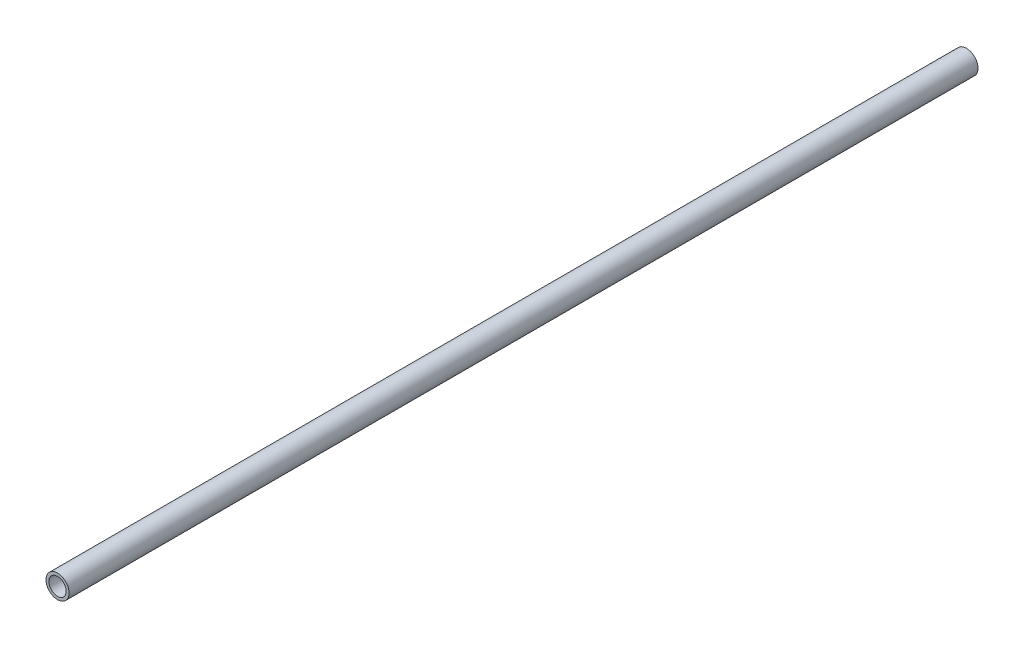
ISO-10303-21;
HEADER;
FILE_DESCRIPTION(('STEP AP214'),'2;1');
FILE_NAME('part.step','',(''),(''),'','','');
FILE_SCHEMA(('AUTOMOTIVE_DESIGN { 1 0 10303 214 1 1 1 1 }'));
ENDSEC;
DATA;
#1=APPLICATION_CONTEXT('core data for automotive mechanical design processes');
#2=APPLICATION_PROTOCOL_DEFINITION('international standard','automotive_design',2000,#1);
#3=PRODUCT_CONTEXT('',#1,'mechanical');
#4=PRODUCT('Part','Part','',(#3));
#5=PRODUCT_RELATED_PRODUCT_CATEGORY('part','',(#4));
#6=PRODUCT_DEFINITION_FORMATION('','',#4);
#7=PRODUCT_DEFINITION_CONTEXT('part definition',#1,'design');
#8=PRODUCT_DEFINITION('design','',#6,#7);
#9=PRODUCT_DEFINITION_SHAPE('','',#8);
#10=(LENGTH_UNIT() NAMED_UNIT(*) SI_UNIT(.MILLI.,.METRE.));
#11=(NAMED_UNIT(*) PLANE_ANGLE_UNIT() SI_UNIT($,.RADIAN.));
#12=(NAMED_UNIT(*) SI_UNIT($,.STERADIAN.) SOLID_ANGLE_UNIT());
#13=UNCERTAINTY_MEASURE_WITH_UNIT(LENGTH_MEASURE(1.E-05),#10,'distance_accuracy_value','');
#14=(GEOMETRIC_REPRESENTATION_CONTEXT(3) GLOBAL_UNCERTAINTY_ASSIGNED_CONTEXT((#13)) GLOBAL_UNIT_ASSIGNED_CONTEXT((#10,
#11,#12)) REPRESENTATION_CONTEXT('',''));
#15=CARTESIAN_POINT('',(0.,0.,0.));
#16=DIRECTION('',(0.,0.,1.));
#17=DIRECTION('',(1.,0.,0.));
#18=AXIS2_PLACEMENT_3D('',#15,#16,#17);
#19=CARTESIAN_POINT('',(0.,0.,500.));
#20=DIRECTION('',(0.,0.,1.));
#21=DIRECTION('',(1.,0.,0.));
#22=AXIS2_PLACEMENT_3D('',#19,#20,#21);
#23=PLANE('',#22);
#24=CARTESIAN_POINT('',(0.,0.,500.));
#25=DIRECTION('',(0.,0.,1.));
#26=DIRECTION('',(1.,0.,0.));
#27=AXIS2_PLACEMENT_3D('',#24,#25,#26);
#28=CIRCLE('',#27,6.35);
#29=CARTESIAN_POINT('',(6.35,0.,500.));
#30=VERTEX_POINT('',#29);
#31=EDGE_CURVE('E10',#30,#30,#28,.T.);
#32=ORIENTED_EDGE('',*,*,#31,.T.);
#33=EDGE_LOOP('',(#32));
#34=FACE_BOUND('',#33,.T.);
#35=CARTESIAN_POINT('',(0.,0.,500.));
#36=DIRECTION('',(0.,0.,1.));
#37=DIRECTION('',(1.,0.,0.));
#38=AXIS2_PLACEMENT_3D('',#35,#36,#37);
#39=CIRCLE('',#38,4.7625);
#40=CARTESIAN_POINT('',(4.7625,0.,500.));
#41=VERTEX_POINT('',#40);
#42=EDGE_CURVE('E38',#41,#41,#39,.T.);
#43=ORIENTED_EDGE('',*,*,#42,.F.);
#44=EDGE_LOOP('',(#43));
#45=FACE_BOUND('',#44,.T.);
#46=ADVANCED_FACE('F27',(#34,#45),#23,.T.);
#47=CARTESIAN_POINT('',(0.,0.,0.));
#48=DIRECTION('',(0.,0.,1.));
#49=DIRECTION('',(1.,0.,0.));
#50=AXIS2_PLACEMENT_3D('',#47,#48,#49);
#51=PLANE('',#50);
#52=CARTESIAN_POINT('',(0.,0.,0.));
#53=DIRECTION('',(0.,0.,1.));
#54=DIRECTION('',(1.,0.,0.));
#55=AXIS2_PLACEMENT_3D('',#52,#53,#54);
#56=CIRCLE('',#55,6.35);
#57=CARTESIAN_POINT('',(6.35,0.,0.));
#58=VERTEX_POINT('',#57);
#59=EDGE_CURVE('E34',#58,#58,#56,.T.);
#60=ORIENTED_EDGE('',*,*,#59,.F.);
#61=EDGE_LOOP('',(#60));
#62=FACE_BOUND('',#61,.T.);
#63=CARTESIAN_POINT('',(0.,0.,0.));
#64=DIRECTION('',(0.,0.,1.));
#65=DIRECTION('',(1.,0.,0.));
#66=AXIS2_PLACEMENT_3D('',#63,#64,#65);
#67=CIRCLE('',#66,4.7625);
#68=CARTESIAN_POINT('',(4.7625,0.,0.));
#69=VERTEX_POINT('',#68);
#70=EDGE_CURVE('E42',#69,#69,#67,.T.);
#71=ORIENTED_EDGE('',*,*,#70,.T.);
#72=EDGE_LOOP('',(#71));
#73=FACE_BOUND('',#72,.T.);
#74=ADVANCED_FACE('F48',(#62,#73),#51,.F.);
#75=CARTESIAN_POINT('',(0.,0.,500.));
#76=DIRECTION('',(0.,0.,-1.));
#77=DIRECTION('',(-1.,0.,0.));
#78=AXIS2_PLACEMENT_3D('',#75,#76,#77);
#79=CYLINDRICAL_SURFACE('',#78,6.35);
#80=ORIENTED_EDGE('',*,*,#31,.F.);
#81=EDGE_LOOP('',(#80));
#82=FACE_BOUND('',#81,.T.);
#83=ORIENTED_EDGE('',*,*,#59,.T.);
#84=EDGE_LOOP('',(#83));
#85=FACE_BOUND('',#84,.T.);
#86=ADVANCED_FACE('F29',(#82,#85),#79,.T.);
#87=CARTESIAN_POINT('',(0.,0.,500.));
#88=DIRECTION('',(0.,0.,-1.));
#89=DIRECTION('',(-1.,0.,0.));
#90=AXIS2_PLACEMENT_3D('',#87,#88,#89);
#91=CYLINDRICAL_SURFACE('',#90,4.7625);
#92=ORIENTED_EDGE('',*,*,#42,.T.);
#93=EDGE_LOOP('',(#92));
#94=FACE_BOUND('',#93,.T.);
#95=ORIENTED_EDGE('',*,*,#70,.F.);
#96=EDGE_LOOP('',(#95));
#97=FACE_BOUND('',#96,.T.);
#98=ADVANCED_FACE('F50',(#94,#97),#91,.F.);
#99=CLOSED_SHELL('',(#46,#74,#86,#98));
#100=MANIFOLD_SOLID_BREP('B2',#99);
#101=ADVANCED_BREP_SHAPE_REPRESENTATION('',(#18,#100),#14);
#102=SHAPE_DEFINITION_REPRESENTATION(#9,#101);
ENDSEC;
END-ISO-10303-21;
